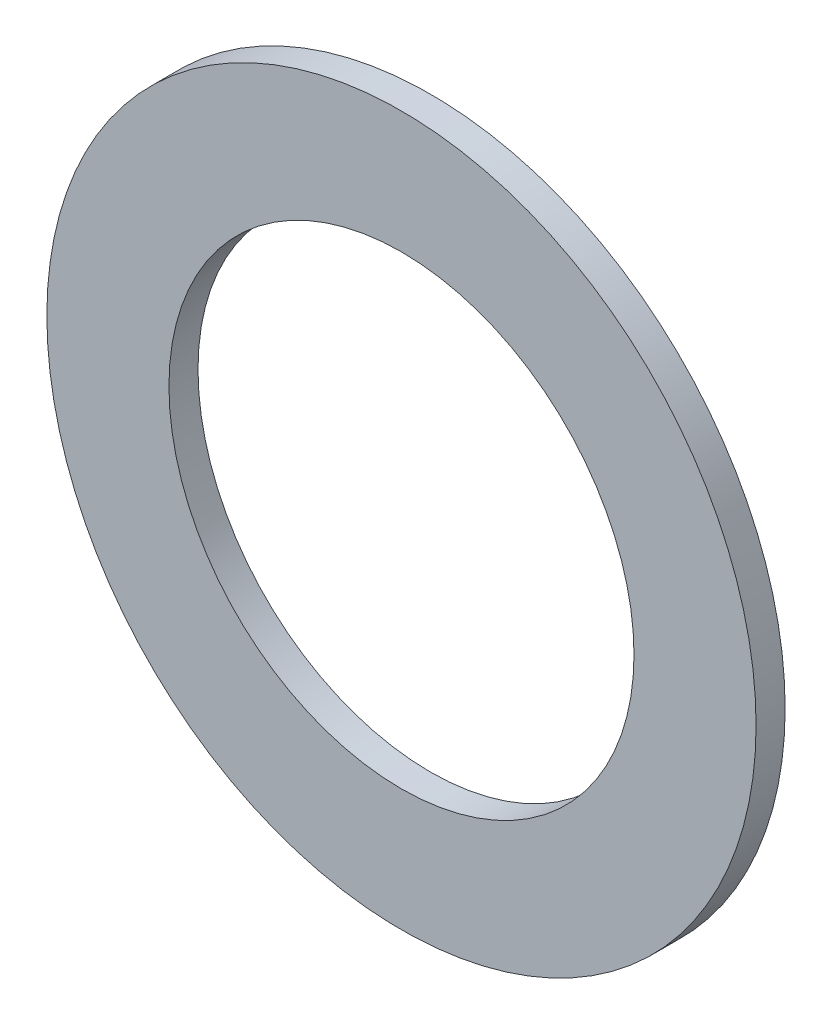
ISO-10303-21;
HEADER;
FILE_DESCRIPTION(('STEP AP214'),'2;1');
FILE_NAME('part.step','',(''),(''),'','','');
FILE_SCHEMA(('AUTOMOTIVE_DESIGN { 1 0 10303 214 1 1 1 1 }'));
ENDSEC;
DATA;
#1=APPLICATION_CONTEXT('core data for automotive mechanical design processes');
#2=APPLICATION_PROTOCOL_DEFINITION('international standard','automotive_design',2000,#1);
#3=PRODUCT_CONTEXT('',#1,'mechanical');
#4=PRODUCT('Part','Part','',(#3));
#5=PRODUCT_RELATED_PRODUCT_CATEGORY('part','',(#4));
#6=PRODUCT_DEFINITION_FORMATION('','',#4);
#7=PRODUCT_DEFINITION_CONTEXT('part definition',#1,'design');
#8=PRODUCT_DEFINITION('design','',#6,#7);
#9=PRODUCT_DEFINITION_SHAPE('','',#8);
#10=(LENGTH_UNIT() NAMED_UNIT(*) SI_UNIT(.MILLI.,.METRE.));
#11=(NAMED_UNIT(*) PLANE_ANGLE_UNIT() SI_UNIT($,.RADIAN.));
#12=(NAMED_UNIT(*) SI_UNIT($,.STERADIAN.) SOLID_ANGLE_UNIT());
#13=UNCERTAINTY_MEASURE_WITH_UNIT(LENGTH_MEASURE(1.E-05),#10,'distance_accuracy_value','');
#14=(GEOMETRIC_REPRESENTATION_CONTEXT(3) GLOBAL_UNCERTAINTY_ASSIGNED_CONTEXT((#13)) GLOBAL_UNIT_ASSIGNED_CONTEXT((#10,
#11,#12)) REPRESENTATION_CONTEXT('',''));
#15=CARTESIAN_POINT('',(0.,0.,0.));
#16=DIRECTION('',(0.,0.,1.));
#17=DIRECTION('',(1.,0.,0.));
#18=AXIS2_PLACEMENT_3D('',#15,#16,#17);
#19=CARTESIAN_POINT('',(0.,0.,1.));
#20=DIRECTION('',(0.,0.,1.));
#21=DIRECTION('',(1.,0.,0.));
#22=AXIS2_PLACEMENT_3D('',#19,#20,#21);
#23=PLANE('',#22);
#24=CARTESIAN_POINT('',(0.,0.,1.));
#25=DIRECTION('',(0.,0.,1.));
#26=DIRECTION('',(1.,0.,0.));
#27=AXIS2_PLACEMENT_3D('',#24,#25,#26);
#28=CIRCLE('',#27,12.2);
#29=CARTESIAN_POINT('',(12.2,0.,1.));
#30=VERTEX_POINT('',#29);
#31=EDGE_CURVE('E12',#30,#30,#28,.T.);
#32=ORIENTED_EDGE('',*,*,#31,.T.);
#33=EDGE_LOOP('',(#32));
#34=FACE_BOUND('',#33,.T.);
#35=CARTESIAN_POINT('',(0.,0.,1.));
#36=DIRECTION('',(0.,0.,1.));
#37=DIRECTION('',(1.,0.,0.));
#38=AXIS2_PLACEMENT_3D('',#35,#36,#37);
#39=CIRCLE('',#38,8.);
#40=CARTESIAN_POINT('',(8.,0.,1.));
#41=VERTEX_POINT('',#40);
#42=EDGE_CURVE('E53',#41,#41,#39,.T.);
#43=ORIENTED_EDGE('',*,*,#42,.F.);
#44=EDGE_LOOP('',(#43));
#45=FACE_BOUND('',#44,.T.);
#46=ADVANCED_FACE('F42',(#34,#45),#23,.T.);
#47=CARTESIAN_POINT('',(0.,0.,0.));
#48=DIRECTION('',(0.,0.,1.));
#49=DIRECTION('',(1.,0.,0.));
#50=AXIS2_PLACEMENT_3D('',#47,#48,#49);
#51=PLANE('',#50);
#52=CARTESIAN_POINT('',(0.,0.,0.));
#53=DIRECTION('',(0.,0.,1.));
#54=DIRECTION('',(1.,0.,0.));
#55=AXIS2_PLACEMENT_3D('',#52,#53,#54);
#56=CIRCLE('',#55,12.2);
#57=CARTESIAN_POINT('',(12.2,0.,0.));
#58=VERTEX_POINT('',#57);
#59=EDGE_CURVE('E46',#58,#58,#56,.T.);
#60=ORIENTED_EDGE('',*,*,#59,.F.);
#61=EDGE_LOOP('',(#60));
#62=FACE_BOUND('',#61,.T.);
#63=CARTESIAN_POINT('',(0.,0.,0.));
#64=DIRECTION('',(0.,0.,1.));
#65=DIRECTION('',(1.,0.,0.));
#66=AXIS2_PLACEMENT_3D('',#63,#64,#65);
#67=CIRCLE('',#66,8.);
#68=CARTESIAN_POINT('',(8.,0.,0.));
#69=VERTEX_POINT('',#68);
#70=EDGE_CURVE('E55',#69,#69,#67,.T.);
#71=ORIENTED_EDGE('',*,*,#70,.T.);
#72=EDGE_LOOP('',(#71));
#73=FACE_BOUND('',#72,.T.);
#74=ADVANCED_FACE('F65',(#62,#73),#51,.F.);
#75=CARTESIAN_POINT('',(0.,0.,1.));
#76=DIRECTION('',(0.,0.,-1.));
#77=DIRECTION('',(-1.,0.,0.));
#78=AXIS2_PLACEMENT_3D('',#75,#76,#77);
#79=CYLINDRICAL_SURFACE('',#78,12.2);
#80=ORIENTED_EDGE('',*,*,#31,.F.);
#81=EDGE_LOOP('',(#80));
#82=FACE_BOUND('',#81,.T.);
#83=ORIENTED_EDGE('',*,*,#59,.T.);
#84=EDGE_LOOP('',(#83));
#85=FACE_BOUND('',#84,.T.);
#86=ADVANCED_FACE('F44',(#82,#85),#79,.T.);
#87=CARTESIAN_POINT('',(0.,0.,1.));
#88=DIRECTION('',(0.,0.,-1.));
#89=DIRECTION('',(-1.,0.,0.));
#90=AXIS2_PLACEMENT_3D('',#87,#88,#89);
#91=CYLINDRICAL_SURFACE('',#90,8.);
#92=ORIENTED_EDGE('',*,*,#42,.T.);
#93=EDGE_LOOP('',(#92));
#94=FACE_BOUND('',#93,.T.);
#95=ORIENTED_EDGE('',*,*,#70,.F.);
#96=EDGE_LOOP('',(#95));
#97=FACE_BOUND('',#96,.T.);
#98=ADVANCED_FACE('F61',(#94,#97),#91,.F.);
#99=CLOSED_SHELL('',(#46,#74,#86,#98));
#100=MANIFOLD_SOLID_BREP('B2',#99);
#101=ADVANCED_BREP_SHAPE_REPRESENTATION('',(#18,#100),#14);
#102=SHAPE_DEFINITION_REPRESENTATION(#9,#101);
ENDSEC;
END-ISO-10303-21;
